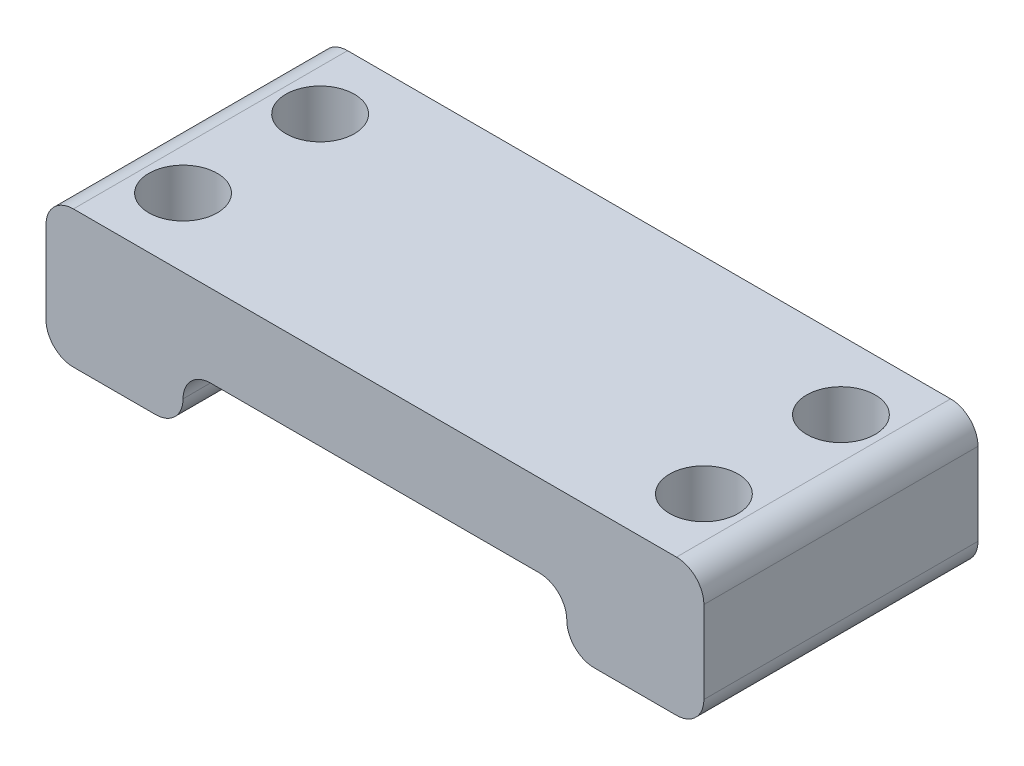
ISO-10303-21;
HEADER;
FILE_DESCRIPTION(('STEP AP214'),'2;1');
FILE_NAME('part.step','',(''),(''),'','','');
FILE_SCHEMA(('AUTOMOTIVE_DESIGN { 1 0 10303 214 1 1 1 1 }'));
ENDSEC;
DATA;
#1=APPLICATION_CONTEXT('core data for automotive mechanical design processes');
#2=APPLICATION_PROTOCOL_DEFINITION('international standard','automotive_design',2000,#1);
#3=PRODUCT_CONTEXT('',#1,'mechanical');
#4=PRODUCT('Part','Part','',(#3));
#5=PRODUCT_RELATED_PRODUCT_CATEGORY('part','',(#4));
#6=PRODUCT_DEFINITION_FORMATION('','',#4);
#7=PRODUCT_DEFINITION_CONTEXT('part definition',#1,'design');
#8=PRODUCT_DEFINITION('design','',#6,#7);
#9=PRODUCT_DEFINITION_SHAPE('','',#8);
#10=(LENGTH_UNIT() NAMED_UNIT(*) SI_UNIT(.MILLI.,.METRE.));
#11=(NAMED_UNIT(*) PLANE_ANGLE_UNIT() SI_UNIT($,.RADIAN.));
#12=(NAMED_UNIT(*) SI_UNIT($,.STERADIAN.) SOLID_ANGLE_UNIT());
#13=UNCERTAINTY_MEASURE_WITH_UNIT(LENGTH_MEASURE(1.E-05),#10,'distance_accuracy_value','');
#14=(GEOMETRIC_REPRESENTATION_CONTEXT(3) GLOBAL_UNCERTAINTY_ASSIGNED_CONTEXT((#13)) GLOBAL_UNIT_ASSIGNED_CONTEXT((#10,
#11,#12)) REPRESENTATION_CONTEXT('',''));
#15=CARTESIAN_POINT('',(0.,0.,0.));
#16=DIRECTION('',(0.,0.,1.));
#17=DIRECTION('',(1.,0.,0.));
#18=AXIS2_PLACEMENT_3D('',#15,#16,#17);
#19=CARTESIAN_POINT('',(0.,0.,0.));
#20=DIRECTION('',(0.,1.,0.));
#21=DIRECTION('',(0.,0.,1.));
#22=AXIS2_PLACEMENT_3D('',#19,#20,#21);
#23=PLANE('',#22);
#24=CARTESIAN_POINT('',(9.5,0.,-2.5));
#25=DIRECTION('',(0.,1.,0.));
#26=DIRECTION('',(0.,0.,1.));
#27=AXIS2_PLACEMENT_3D('',#24,#25,#26);
#28=CIRCLE('',#27,1.25);
#29=CARTESIAN_POINT('',(9.5,0.,-1.25));
#30=VERTEX_POINT('',#29);
#31=EDGE_CURVE('E275',#30,#30,#28,.T.);
#32=ORIENTED_EDGE('',*,*,#31,.T.);
#33=EDGE_LOOP('',(#32));
#34=FACE_BOUND('',#33,.T.);
#35=CARTESIAN_POINT('',(9.5,0.,2.5));
#36=DIRECTION('',(0.,1.,0.));
#37=DIRECTION('',(0.,0.,1.));
#38=AXIS2_PLACEMENT_3D('',#35,#36,#37);
#39=CIRCLE('',#38,1.25);
#40=CARTESIAN_POINT('',(9.5,0.,3.75));
#41=VERTEX_POINT('',#40);
#42=EDGE_CURVE('E488',#41,#41,#39,.T.);
#43=ORIENTED_EDGE('',*,*,#42,.T.);
#44=EDGE_LOOP('',(#43));
#45=FACE_BOUND('',#44,.T.);
#46=DIRECTION('',(-1.,0.,0.));
#47=VECTOR('',#46,1.);
#48=CARTESIAN_POINT('',(-12.,0.,-5.));
#49=LINE('',#48,#47);
#50=CARTESIAN_POINT('',(11.,0.,-5.));
#51=VERTEX_POINT('',#50);
#52=CARTESIAN_POINT('',(8.,0.,-5.));
#53=VERTEX_POINT('',#52);
#54=EDGE_CURVE('E292',#51,#53,#49,.T.);
#55=ORIENTED_EDGE('',*,*,#54,.F.);
#56=DIRECTION('',(0.,0.,-1.));
#57=VECTOR('',#56,1.);
#58=CARTESIAN_POINT('',(11.,0.,0.));
#59=LINE('',#58,#57);
#60=CARTESIAN_POINT('',(11.,0.,5.));
#61=VERTEX_POINT('',#60);
#62=EDGE_CURVE('E233',#51,#61,#59,.F.);
#63=ORIENTED_EDGE('',*,*,#62,.T.);
#64=DIRECTION('',(1.,0.,0.));
#65=VECTOR('',#64,1.);
#66=CARTESIAN_POINT('',(-12.,0.,5.));
#67=LINE('',#66,#65);
#68=CARTESIAN_POINT('',(8.,0.,5.));
#69=VERTEX_POINT('',#68);
#70=EDGE_CURVE('E296',#69,#61,#67,.T.);
#71=ORIENTED_EDGE('',*,*,#70,.F.);
#72=DIRECTION('',(0.,0.,1.));
#73=VECTOR('',#72,1.);
#74=CARTESIAN_POINT('',(8.,0.,0.));
#75=LINE('',#74,#73);
#76=EDGE_CURVE('E229',#69,#53,#75,.F.);
#77=ORIENTED_EDGE('',*,*,#76,.T.);
#78=EDGE_LOOP('',(#55,#63,#71,#77));
#79=FACE_BOUND('',#78,.T.);
#80=ADVANCED_FACE('F39',(#34,#45,#79),#23,.F.);
#81=CARTESIAN_POINT('',(12.,5.,-5.));
#82=DIRECTION('',(-1.,0.,0.));
#83=DIRECTION('',(0.,0.,1.));
#84=AXIS2_PLACEMENT_3D('',#81,#82,#83);
#85=PLANE('',#84);
#86=DIRECTION('',(0.,-1.,0.));
#87=VECTOR('',#86,1.);
#88=CARTESIAN_POINT('',(12.,5.,-5.));
#89=LINE('',#88,#87);
#90=CARTESIAN_POINT('',(12.,4.,-5.));
#91=VERTEX_POINT('',#90);
#92=CARTESIAN_POINT('',(12.,1.,-5.));
#93=VERTEX_POINT('',#92);
#94=EDGE_CURVE('E174',#91,#93,#89,.T.);
#95=ORIENTED_EDGE('',*,*,#94,.F.);
#96=DIRECTION('',(0.,0.,-1.));
#97=VECTOR('',#96,1.);
#98=CARTESIAN_POINT('',(12.,4.,5.));
#99=LINE('',#98,#97);
#100=CARTESIAN_POINT('',(12.,4.,5.));
#101=VERTEX_POINT('',#100);
#102=EDGE_CURVE('E226',#91,#101,#99,.F.);
#103=ORIENTED_EDGE('',*,*,#102,.T.);
#104=DIRECTION('',(0.,-1.,0.));
#105=VECTOR('',#104,1.);
#106=CARTESIAN_POINT('',(12.,5.,5.));
#107=LINE('',#106,#105);
#108=CARTESIAN_POINT('',(12.,1.,5.));
#109=VERTEX_POINT('',#108);
#110=EDGE_CURVE('E168',#101,#109,#107,.T.);
#111=ORIENTED_EDGE('',*,*,#110,.T.);
#112=DIRECTION('',(0.,0.,-1.));
#113=VECTOR('',#112,1.);
#114=CARTESIAN_POINT('',(12.,1.,-5.));
#115=LINE('',#114,#113);
#116=EDGE_CURVE('E223',#109,#93,#115,.T.);
#117=ORIENTED_EDGE('',*,*,#116,.T.);
#118=EDGE_LOOP('',(#95,#103,#111,#117));
#119=FACE_BOUND('',#118,.T.);
#120=ADVANCED_FACE('F340',(#119),#85,.F.);
#121=CARTESIAN_POINT('',(-12.,5.,-5.));
#122=DIRECTION('',(0.,0.,1.));
#123=DIRECTION('',(1.,0.,0.));
#124=AXIS2_PLACEMENT_3D('',#121,#122,#123);
#125=PLANE('',#124);
#126=CARTESIAN_POINT('',(-8.,0.,-5.));
#127=VERTEX_POINT('',#126);
#128=CARTESIAN_POINT('',(-11.,0.,-5.));
#129=VERTEX_POINT('',#128);
#130=EDGE_CURVE('E283',#127,#129,#49,.T.);
#131=ORIENTED_EDGE('',*,*,#130,.T.);
#132=CARTESIAN_POINT('',(-11.,1.,-5.));
#133=DIRECTION('',(0.,0.,1.));
#134=DIRECTION('',(1.,0.,0.));
#135=AXIS2_PLACEMENT_3D('',#132,#133,#134);
#136=CIRCLE('',#135,1.);
#137=CARTESIAN_POINT('',(-12.,1.,-5.));
#138=VERTEX_POINT('',#137);
#139=EDGE_CURVE('E213',#129,#138,#136,.F.);
#140=ORIENTED_EDGE('',*,*,#139,.T.);
#141=DIRECTION('',(0.,-1.,0.));
#142=VECTOR('',#141,1.);
#143=CARTESIAN_POINT('',(-12.,5.,-5.));
#144=LINE('',#143,#142);
#145=CARTESIAN_POINT('',(-12.,4.,-5.));
#146=VERTEX_POINT('',#145);
#147=EDGE_CURVE('E167',#146,#138,#144,.T.);
#148=ORIENTED_EDGE('',*,*,#147,.F.);
#149=CARTESIAN_POINT('',(-11.,4.,-5.));
#150=DIRECTION('',(0.,0.,1.));
#151=DIRECTION('',(1.,0.,0.));
#152=AXIS2_PLACEMENT_3D('',#149,#150,#151);
#153=CIRCLE('',#152,1.);
#154=CARTESIAN_POINT('',(-11.,5.,-5.));
#155=VERTEX_POINT('',#154);
#156=EDGE_CURVE('E172',#146,#155,#153,.F.);
#157=ORIENTED_EDGE('',*,*,#156,.T.);
#158=DIRECTION('',(-1.,0.,0.));
#159=VECTOR('',#158,1.);
#160=CARTESIAN_POINT('',(-12.,5.,-5.));
#161=LINE('',#160,#159);
#162=CARTESIAN_POINT('',(11.,5.,-5.));
#163=VERTEX_POINT('',#162);
#164=EDGE_CURVE('E285',#163,#155,#161,.T.);
#165=ORIENTED_EDGE('',*,*,#164,.F.);
#166=CARTESIAN_POINT('',(11.,4.,-5.));
#167=DIRECTION('',(0.,0.,1.));
#168=DIRECTION('',(1.,0.,0.));
#169=AXIS2_PLACEMENT_3D('',#166,#167,#168);
#170=CIRCLE('',#169,1.);
#171=EDGE_CURVE('E65',#163,#91,#170,.F.);
#172=ORIENTED_EDGE('',*,*,#171,.T.);
#173=ORIENTED_EDGE('',*,*,#94,.T.);
#174=CARTESIAN_POINT('',(11.,1.,-5.));
#175=DIRECTION('',(0.,0.,1.));
#176=DIRECTION('',(1.,0.,0.));
#177=AXIS2_PLACEMENT_3D('',#174,#175,#176);
#178=CIRCLE('',#177,1.);
#179=EDGE_CURVE('E57',#93,#51,#178,.F.);
#180=ORIENTED_EDGE('',*,*,#179,.T.);
#181=ORIENTED_EDGE('',*,*,#54,.T.);
#182=CARTESIAN_POINT('',(8.,1.,-5.));
#183=DIRECTION('',(0.,0.,1.));
#184=DIRECTION('',(1.,0.,0.));
#185=AXIS2_PLACEMENT_3D('',#182,#183,#184);
#186=CIRCLE('',#185,1.);
#187=CARTESIAN_POINT('',(7.,1.,-5.));
#188=VERTEX_POINT('',#187);
#189=EDGE_CURVE('E204',#53,#188,#186,.F.);
#190=ORIENTED_EDGE('',*,*,#189,.T.);
#191=CARTESIAN_POINT('',(6.,1.,-5.));
#192=DIRECTION('',(0.,0.,1.));
#193=DIRECTION('',(1.,0.,0.));
#194=AXIS2_PLACEMENT_3D('',#191,#192,#193);
#195=CIRCLE('',#194,1.);
#196=CARTESIAN_POINT('',(6.,2.,-5.));
#197=VERTEX_POINT('',#196);
#198=EDGE_CURVE('E246',#188,#197,#195,.T.);
#199=ORIENTED_EDGE('',*,*,#198,.T.);
#200=DIRECTION('',(-1.,0.,0.));
#201=VECTOR('',#200,1.);
#202=CARTESIAN_POINT('',(-7.,2.,-5.));
#203=LINE('',#202,#201);
#204=CARTESIAN_POINT('',(-6.,2.,-5.));
#205=VERTEX_POINT('',#204);
#206=EDGE_CURVE('E260',#197,#205,#203,.T.);
#207=ORIENTED_EDGE('',*,*,#206,.T.);
#208=CARTESIAN_POINT('',(-6.,1.,-5.));
#209=DIRECTION('',(0.,0.,1.));
#210=DIRECTION('',(1.,0.,0.));
#211=AXIS2_PLACEMENT_3D('',#208,#209,#210);
#212=CIRCLE('',#211,1.);
#213=CARTESIAN_POINT('',(-7.,1.,-5.));
#214=VERTEX_POINT('',#213);
#215=EDGE_CURVE('E11',#205,#214,#212,.T.);
#216=ORIENTED_EDGE('',*,*,#215,.T.);
#217=CARTESIAN_POINT('',(-8.,1.,-5.));
#218=DIRECTION('',(0.,0.,1.));
#219=DIRECTION('',(1.,0.,0.));
#220=AXIS2_PLACEMENT_3D('',#217,#218,#219);
#221=CIRCLE('',#220,1.);
#222=EDGE_CURVE('E201',#214,#127,#221,.F.);
#223=ORIENTED_EDGE('',*,*,#222,.T.);
#224=EDGE_LOOP('',(#131,#140,#148,#157,#165,#172,#173,#180,#181,#190,#199,#207,#216,#223));
#225=FACE_BOUND('',#224,.T.);
#226=ADVANCED_FACE('F324',(#225),#125,.F.);
#227=CARTESIAN_POINT('',(-12.,5.,-5.));
#228=DIRECTION('',(1.,0.,0.));
#229=DIRECTION('',(0.,0.,-1.));
#230=AXIS2_PLACEMENT_3D('',#227,#228,#229);
#231=PLANE('',#230);
#232=ORIENTED_EDGE('',*,*,#147,.T.);
#233=DIRECTION('',(0.,0.,1.));
#234=VECTOR('',#233,1.);
#235=CARTESIAN_POINT('',(-12.,1.,-5.));
#236=LINE('',#235,#234);
#237=CARTESIAN_POINT('',(-12.,1.,5.));
#238=VERTEX_POINT('',#237);
#239=EDGE_CURVE('E165',#138,#238,#236,.T.);
#240=ORIENTED_EDGE('',*,*,#239,.T.);
#241=DIRECTION('',(0.,-1.,0.));
#242=VECTOR('',#241,1.);
#243=CARTESIAN_POINT('',(-12.,5.,5.));
#244=LINE('',#243,#242);
#245=CARTESIAN_POINT('',(-12.,4.,5.));
#246=VERTEX_POINT('',#245);
#247=EDGE_CURVE('E147',#246,#238,#244,.T.);
#248=ORIENTED_EDGE('',*,*,#247,.F.);
#249=DIRECTION('',(0.,0.,1.));
#250=VECTOR('',#249,1.);
#251=CARTESIAN_POINT('',(-12.,4.,-5.));
#252=LINE('',#251,#250);
#253=EDGE_CURVE('E162',#246,#146,#252,.F.);
#254=ORIENTED_EDGE('',*,*,#253,.T.);
#255=EDGE_LOOP('',(#232,#240,#248,#254));
#256=FACE_BOUND('',#255,.T.);
#257=ADVANCED_FACE('F161',(#256),#231,.F.);
#258=CARTESIAN_POINT('',(-12.,5.,5.));
#259=DIRECTION('',(0.,0.,-1.));
#260=DIRECTION('',(-1.,0.,0.));
#261=AXIS2_PLACEMENT_3D('',#258,#259,#260);
#262=PLANE('',#261);
#263=ORIENTED_EDGE('',*,*,#247,.T.);
#264=CARTESIAN_POINT('',(-11.,1.,5.));
#265=DIRECTION('',(0.,0.,-1.));
#266=DIRECTION('',(-1.,0.,0.));
#267=AXIS2_PLACEMENT_3D('',#264,#265,#266);
#268=CIRCLE('',#267,1.);
#269=CARTESIAN_POINT('',(-11.,0.,5.));
#270=VERTEX_POINT('',#269);
#271=EDGE_CURVE('E155',#238,#270,#268,.F.);
#272=ORIENTED_EDGE('',*,*,#271,.T.);
#273=CARTESIAN_POINT('',(-8.,0.,5.));
#274=VERTEX_POINT('',#273);
#275=EDGE_CURVE('E289',#270,#274,#67,.T.);
#276=ORIENTED_EDGE('',*,*,#275,.T.);
#277=CARTESIAN_POINT('',(-8.,1.,5.));
#278=DIRECTION('',(0.,0.,-1.));
#279=DIRECTION('',(-1.,0.,0.));
#280=AXIS2_PLACEMENT_3D('',#277,#278,#279);
#281=CIRCLE('',#280,1.);
#282=CARTESIAN_POINT('',(-7.,1.,5.));
#283=VERTEX_POINT('',#282);
#284=EDGE_CURVE('E178',#274,#283,#281,.F.);
#285=ORIENTED_EDGE('',*,*,#284,.T.);
#286=CARTESIAN_POINT('',(-6.,1.,5.));
#287=DIRECTION('',(0.,0.,-1.));
#288=DIRECTION('',(-1.,0.,0.));
#289=AXIS2_PLACEMENT_3D('',#286,#287,#288);
#290=CIRCLE('',#289,1.);
#291=CARTESIAN_POINT('',(-6.,2.,5.));
#292=VERTEX_POINT('',#291);
#293=EDGE_CURVE('E49',#283,#292,#290,.T.);
#294=ORIENTED_EDGE('',*,*,#293,.T.);
#295=DIRECTION('',(-1.,0.,0.));
#296=VECTOR('',#295,1.);
#297=CARTESIAN_POINT('',(-7.,2.,5.));
#298=LINE('',#297,#296);
#299=CARTESIAN_POINT('',(6.,2.,5.));
#300=VERTEX_POINT('',#299);
#301=EDGE_CURVE('E253',#300,#292,#298,.T.);
#302=ORIENTED_EDGE('',*,*,#301,.F.);
#303=CARTESIAN_POINT('',(6.,1.,5.));
#304=DIRECTION('',(0.,0.,-1.));
#305=DIRECTION('',(-1.,0.,0.));
#306=AXIS2_PLACEMENT_3D('',#303,#304,#305);
#307=CIRCLE('',#306,1.);
#308=CARTESIAN_POINT('',(7.,1.,5.));
#309=VERTEX_POINT('',#308);
#310=EDGE_CURVE('E243',#300,#309,#307,.T.);
#311=ORIENTED_EDGE('',*,*,#310,.T.);
#312=CARTESIAN_POINT('',(8.,1.,5.));
#313=DIRECTION('',(0.,0.,-1.));
#314=DIRECTION('',(-1.,0.,0.));
#315=AXIS2_PLACEMENT_3D('',#312,#313,#314);
#316=CIRCLE('',#315,1.);
#317=EDGE_CURVE('E185',#309,#69,#316,.F.);
#318=ORIENTED_EDGE('',*,*,#317,.T.);
#319=ORIENTED_EDGE('',*,*,#70,.T.);
#320=CARTESIAN_POINT('',(11.,1.,5.));
#321=DIRECTION('',(0.,0.,-1.));
#322=DIRECTION('',(-1.,0.,0.));
#323=AXIS2_PLACEMENT_3D('',#320,#321,#322);
#324=CIRCLE('',#323,1.);
#325=EDGE_CURVE('E188',#61,#109,#324,.F.);
#326=ORIENTED_EDGE('',*,*,#325,.T.);
#327=ORIENTED_EDGE('',*,*,#110,.F.);
#328=CARTESIAN_POINT('',(11.,4.,5.));
#329=DIRECTION('',(0.,0.,-1.));
#330=DIRECTION('',(-1.,0.,0.));
#331=AXIS2_PLACEMENT_3D('',#328,#329,#330);
#332=CIRCLE('',#331,1.);
#333=CARTESIAN_POINT('',(11.,5.,5.));
#334=VERTEX_POINT('',#333);
#335=EDGE_CURVE('E156',#101,#334,#332,.F.);
#336=ORIENTED_EDGE('',*,*,#335,.T.);
#337=DIRECTION('',(1.,0.,0.));
#338=VECTOR('',#337,1.);
#339=CARTESIAN_POINT('',(-12.,5.,5.));
#340=LINE('',#339,#338);
#341=CARTESIAN_POINT('',(-11.,5.,5.));
#342=VERTEX_POINT('',#341);
#343=EDGE_CURVE('E149',#342,#334,#340,.T.);
#344=ORIENTED_EDGE('',*,*,#343,.F.);
#345=CARTESIAN_POINT('',(-11.,4.,5.));
#346=DIRECTION('',(0.,0.,-1.));
#347=DIRECTION('',(-1.,0.,0.));
#348=AXIS2_PLACEMENT_3D('',#345,#346,#347);
#349=CIRCLE('',#348,1.);
#350=EDGE_CURVE('E144',#342,#246,#349,.F.);
#351=ORIENTED_EDGE('',*,*,#350,.T.);
#352=EDGE_LOOP('',(#263,#272,#276,#285,#294,#302,#311,#318,#319,#326,#327,#336,#344,#351));
#353=FACE_BOUND('',#352,.T.);
#354=ADVANCED_FACE('F146',(#353),#262,.F.);
#355=CARTESIAN_POINT('',(0.,5.,0.));
#356=DIRECTION('',(0.,1.,0.));
#357=DIRECTION('',(0.,0.,1.));
#358=AXIS2_PLACEMENT_3D('',#355,#356,#357);
#359=PLANE('',#358);
#360=CARTESIAN_POINT('',(9.5,5.,-2.5));
#361=DIRECTION('',(0.,1.,0.));
#362=DIRECTION('',(0.,0.,1.));
#363=AXIS2_PLACEMENT_3D('',#360,#361,#362);
#364=CIRCLE('',#363,1.25);
#365=CARTESIAN_POINT('',(9.5,5.,-1.25));
#366=VERTEX_POINT('',#365);
#367=EDGE_CURVE('E475',#366,#366,#364,.T.);
#368=ORIENTED_EDGE('',*,*,#367,.F.);
#369=EDGE_LOOP('',(#368));
#370=FACE_BOUND('',#369,.T.);
#371=CARTESIAN_POINT('',(-9.5,5.,2.5));
#372=DIRECTION('',(0.,1.,0.));
#373=DIRECTION('',(0.,0.,1.));
#374=AXIS2_PLACEMENT_3D('',#371,#372,#373);
#375=CIRCLE('',#374,1.25);
#376=CARTESIAN_POINT('',(-9.5,5.,3.75));
#377=VERTEX_POINT('',#376);
#378=EDGE_CURVE('E278',#377,#377,#375,.T.);
#379=ORIENTED_EDGE('',*,*,#378,.F.);
#380=EDGE_LOOP('',(#379));
#381=FACE_BOUND('',#380,.T.);
#382=CARTESIAN_POINT('',(9.5,5.,2.5));
#383=DIRECTION('',(0.,1.,0.));
#384=DIRECTION('',(0.,0.,1.));
#385=AXIS2_PLACEMENT_3D('',#382,#383,#384);
#386=CIRCLE('',#385,1.25);
#387=CARTESIAN_POINT('',(9.5,5.,3.75));
#388=VERTEX_POINT('',#387);
#389=EDGE_CURVE('E484',#388,#388,#386,.T.);
#390=ORIENTED_EDGE('',*,*,#389,.F.);
#391=EDGE_LOOP('',(#390));
#392=FACE_BOUND('',#391,.T.);
#393=CARTESIAN_POINT('',(-9.5,5.,-2.5));
#394=DIRECTION('',(0.,1.,0.));
#395=DIRECTION('',(0.,0.,1.));
#396=AXIS2_PLACEMENT_3D('',#393,#394,#395);
#397=CIRCLE('',#396,1.25);
#398=CARTESIAN_POINT('',(-9.5,5.,-1.25));
#399=VERTEX_POINT('',#398);
#400=EDGE_CURVE('E269',#399,#399,#397,.T.);
#401=ORIENTED_EDGE('',*,*,#400,.F.);
#402=EDGE_LOOP('',(#401));
#403=FACE_BOUND('',#402,.T.);
#404=ORIENTED_EDGE('',*,*,#164,.T.);
#405=DIRECTION('',(0.,0.,1.));
#406=VECTOR('',#405,1.);
#407=CARTESIAN_POINT('',(-11.,5.,5.));
#408=LINE('',#407,#406);
#409=EDGE_CURVE('E220',#155,#342,#408,.T.);
#410=ORIENTED_EDGE('',*,*,#409,.T.);
#411=ORIENTED_EDGE('',*,*,#343,.T.);
#412=DIRECTION('',(0.,0.,-1.));
#413=VECTOR('',#412,1.);
#414=CARTESIAN_POINT('',(11.,5.,-5.));
#415=LINE('',#414,#413);
#416=EDGE_CURVE('E216',#334,#163,#415,.T.);
#417=ORIENTED_EDGE('',*,*,#416,.T.);
#418=EDGE_LOOP('',(#404,#410,#411,#417));
#419=FACE_BOUND('',#418,.T.);
#420=ADVANCED_FACE('F346',(#370,#381,#392,#403,#419),#359,.T.);
#421=CARTESIAN_POINT('',(-9.5,0.,2.5));
#422=DIRECTION('',(0.,1.,0.));
#423=DIRECTION('',(0.,0.,1.));
#424=AXIS2_PLACEMENT_3D('',#421,#422,#423);
#425=CIRCLE('',#424,1.25);
#426=CARTESIAN_POINT('',(-9.5,0.,3.75));
#427=VERTEX_POINT('',#426);
#428=EDGE_CURVE('E477',#427,#427,#425,.T.);
#429=ORIENTED_EDGE('',*,*,#428,.T.);
#430=EDGE_LOOP('',(#429));
#431=FACE_BOUND('',#430,.T.);
#432=CARTESIAN_POINT('',(-9.5,0.,-2.5));
#433=DIRECTION('',(0.,1.,0.));
#434=DIRECTION('',(0.,0.,1.));
#435=AXIS2_PLACEMENT_3D('',#432,#433,#434);
#436=CIRCLE('',#435,1.25);
#437=CARTESIAN_POINT('',(-9.5,0.,-1.25));
#438=VERTEX_POINT('',#437);
#439=EDGE_CURVE('E263',#438,#438,#436,.T.);
#440=ORIENTED_EDGE('',*,*,#439,.T.);
#441=EDGE_LOOP('',(#440));
#442=FACE_BOUND('',#441,.T.);
#443=ORIENTED_EDGE('',*,*,#275,.F.);
#444=DIRECTION('',(0.,0.,1.));
#445=VECTOR('',#444,1.);
#446=CARTESIAN_POINT('',(-11.,0.,0.));
#447=LINE('',#446,#445);
#448=EDGE_CURVE('E198',#270,#129,#447,.F.);
#449=ORIENTED_EDGE('',*,*,#448,.T.);
#450=ORIENTED_EDGE('',*,*,#130,.F.);
#451=DIRECTION('',(0.,0.,1.));
#452=VECTOR('',#451,1.);
#453=CARTESIAN_POINT('',(-8.,0.,0.));
#454=LINE('',#453,#452);
#455=EDGE_CURVE('E195',#127,#274,#454,.T.);
#456=ORIENTED_EDGE('',*,*,#455,.T.);
#457=EDGE_LOOP('',(#443,#449,#450,#456));
#458=FACE_BOUND('',#457,.T.);
#459=ADVANCED_FACE('F310',(#431,#442,#458),#23,.F.);
#460=CARTESIAN_POINT('',(-7.,2.,-5.));
#461=DIRECTION('',(0.,1.,0.));
#462=DIRECTION('',(0.,0.,1.));
#463=AXIS2_PLACEMENT_3D('',#460,#461,#462);
#464=PLANE('',#463);
#465=ORIENTED_EDGE('',*,*,#206,.F.);
#466=DIRECTION('',(0.,0.,1.));
#467=VECTOR('',#466,1.);
#468=CARTESIAN_POINT('',(6.,2.,5.));
#469=LINE('',#468,#467);
#470=EDGE_CURVE('E240',#197,#300,#469,.T.);
#471=ORIENTED_EDGE('',*,*,#470,.T.);
#472=ORIENTED_EDGE('',*,*,#301,.T.);
#473=DIRECTION('',(0.,0.,1.));
#474=VECTOR('',#473,1.);
#475=CARTESIAN_POINT('',(-6.,2.,-5.));
#476=LINE('',#475,#474);
#477=EDGE_CURVE('E236',#292,#205,#476,.F.);
#478=ORIENTED_EDGE('',*,*,#477,.T.);
#479=EDGE_LOOP('',(#465,#471,#472,#478));
#480=FACE_BOUND('',#479,.T.);
#481=ADVANCED_FACE('F321',(#480),#464,.F.);
#482=CARTESIAN_POINT('',(-11.,1.,-5.));
#483=DIRECTION('',(0.,0.,1.));
#484=DIRECTION('',(1.,0.,0.));
#485=AXIS2_PLACEMENT_3D('',#482,#483,#484);
#486=CYLINDRICAL_SURFACE('',#485,1.);
#487=ORIENTED_EDGE('',*,*,#139,.F.);
#488=ORIENTED_EDGE('',*,*,#448,.F.);
#489=ORIENTED_EDGE('',*,*,#271,.F.);
#490=ORIENTED_EDGE('',*,*,#239,.F.);
#491=EDGE_LOOP('',(#487,#488,#489,#490));
#492=FACE_BOUND('',#491,.T.);
#493=ADVANCED_FACE('F305',(#492),#486,.T.);
#494=CARTESIAN_POINT('',(-11.,4.,0.));
#495=DIRECTION('',(0.,0.,-1.));
#496=DIRECTION('',(-1.,0.,0.));
#497=AXIS2_PLACEMENT_3D('',#494,#495,#496);
#498=CYLINDRICAL_SURFACE('',#497,1.);
#499=ORIENTED_EDGE('',*,*,#156,.F.);
#500=ORIENTED_EDGE('',*,*,#253,.F.);
#501=ORIENTED_EDGE('',*,*,#350,.F.);
#502=ORIENTED_EDGE('',*,*,#409,.F.);
#503=EDGE_LOOP('',(#499,#500,#501,#502));
#504=FACE_BOUND('',#503,.T.);
#505=ADVANCED_FACE('F171',(#504),#498,.T.);
#506=CARTESIAN_POINT('',(11.,4.,0.));
#507=DIRECTION('',(0.,0.,1.));
#508=DIRECTION('',(1.,0.,0.));
#509=AXIS2_PLACEMENT_3D('',#506,#507,#508);
#510=CYLINDRICAL_SURFACE('',#509,1.);
#511=ORIENTED_EDGE('',*,*,#335,.F.);
#512=ORIENTED_EDGE('',*,*,#102,.F.);
#513=ORIENTED_EDGE('',*,*,#171,.F.);
#514=ORIENTED_EDGE('',*,*,#416,.F.);
#515=EDGE_LOOP('',(#511,#512,#513,#514));
#516=FACE_BOUND('',#515,.T.);
#517=ADVANCED_FACE('F343',(#516),#510,.T.);
#518=CARTESIAN_POINT('',(11.,1.,-5.));
#519=DIRECTION('',(0.,0.,-1.));
#520=DIRECTION('',(-1.,0.,0.));
#521=AXIS2_PLACEMENT_3D('',#518,#519,#520);
#522=CYLINDRICAL_SURFACE('',#521,1.);
#523=ORIENTED_EDGE('',*,*,#325,.F.);
#524=ORIENTED_EDGE('',*,*,#62,.F.);
#525=ORIENTED_EDGE('',*,*,#179,.F.);
#526=ORIENTED_EDGE('',*,*,#116,.F.);
#527=EDGE_LOOP('',(#523,#524,#525,#526));
#528=FACE_BOUND('',#527,.T.);
#529=ADVANCED_FACE('F336',(#528),#522,.T.);
#530=CARTESIAN_POINT('',(6.,1.,-5.));
#531=DIRECTION('',(0.,0.,-1.));
#532=DIRECTION('',(-1.,0.,0.));
#533=AXIS2_PLACEMENT_3D('',#530,#531,#532);
#534=CYLINDRICAL_SURFACE('',#533,1.);
#535=ORIENTED_EDGE('',*,*,#470,.F.);
#536=ORIENTED_EDGE('',*,*,#198,.F.);
#537=DIRECTION('',(0.,0.,1.));
#538=VECTOR('',#537,1.);
#539=CARTESIAN_POINT('',(7.,1.,-5.));
#540=LINE('',#539,#538);
#541=EDGE_CURVE('E250',#309,#188,#540,.F.);
#542=ORIENTED_EDGE('',*,*,#541,.F.);
#543=ORIENTED_EDGE('',*,*,#310,.F.);
#544=EDGE_LOOP('',(#535,#536,#542,#543));
#545=FACE_BOUND('',#544,.T.);
#546=ADVANCED_FACE('F327',(#545),#534,.F.);
#547=CARTESIAN_POINT('',(8.,1.,-5.));
#548=DIRECTION('',(0.,0.,1.));
#549=DIRECTION('',(1.,0.,0.));
#550=AXIS2_PLACEMENT_3D('',#547,#548,#549);
#551=CYLINDRICAL_SURFACE('',#550,1.);
#552=ORIENTED_EDGE('',*,*,#189,.F.);
#553=ORIENTED_EDGE('',*,*,#76,.F.);
#554=ORIENTED_EDGE('',*,*,#317,.F.);
#555=ORIENTED_EDGE('',*,*,#541,.T.);
#556=EDGE_LOOP('',(#552,#553,#554,#555));
#557=FACE_BOUND('',#556,.T.);
#558=ADVANCED_FACE('F335',(#557),#551,.T.);
#559=CARTESIAN_POINT('',(-8.,1.,0.));
#560=DIRECTION('',(0.,0.,1.));
#561=DIRECTION('',(1.,0.,0.));
#562=AXIS2_PLACEMENT_3D('',#559,#560,#561);
#563=CYLINDRICAL_SURFACE('',#562,1.);
#564=ORIENTED_EDGE('',*,*,#455,.F.);
#565=ORIENTED_EDGE('',*,*,#222,.F.);
#566=DIRECTION('',(0.,0.,1.));
#567=VECTOR('',#566,1.);
#568=CARTESIAN_POINT('',(-7.,1.,-5.));
#569=LINE('',#568,#567);
#570=EDGE_CURVE('E43',#283,#214,#569,.F.);
#571=ORIENTED_EDGE('',*,*,#570,.F.);
#572=ORIENTED_EDGE('',*,*,#284,.F.);
#573=EDGE_LOOP('',(#564,#565,#571,#572));
#574=FACE_BOUND('',#573,.T.);
#575=ADVANCED_FACE('F41',(#574),#563,.T.);
#576=CARTESIAN_POINT('',(-6.,1.,-5.));
#577=DIRECTION('',(0.,0.,-1.));
#578=DIRECTION('',(-1.,0.,0.));
#579=AXIS2_PLACEMENT_3D('',#576,#577,#578);
#580=CYLINDRICAL_SURFACE('',#579,1.);
#581=ORIENTED_EDGE('',*,*,#215,.F.);
#582=ORIENTED_EDGE('',*,*,#477,.F.);
#583=ORIENTED_EDGE('',*,*,#293,.F.);
#584=ORIENTED_EDGE('',*,*,#570,.T.);
#585=EDGE_LOOP('',(#581,#582,#583,#584));
#586=FACE_BOUND('',#585,.T.);
#587=ADVANCED_FACE('F323',(#586),#580,.F.);
#588=CARTESIAN_POINT('',(-9.5,0.,-2.5));
#589=DIRECTION('',(0.,1.,0.));
#590=DIRECTION('',(0.,0.,1.));
#591=AXIS2_PLACEMENT_3D('',#588,#589,#590);
#592=CYLINDRICAL_SURFACE('',#591,1.25);
#593=ORIENTED_EDGE('',*,*,#439,.F.);
#594=EDGE_LOOP('',(#593));
#595=FACE_BOUND('',#594,.T.);
#596=ORIENTED_EDGE('',*,*,#400,.T.);
#597=EDGE_LOOP('',(#596));
#598=FACE_BOUND('',#597,.T.);
#599=ADVANCED_FACE('F385',(#595,#598),#592,.F.);
#600=CARTESIAN_POINT('',(-9.5,0.,2.5));
#601=DIRECTION('',(0.,1.,0.));
#602=DIRECTION('',(0.,0.,1.));
#603=AXIS2_PLACEMENT_3D('',#600,#601,#602);
#604=CYLINDRICAL_SURFACE('',#603,1.25);
#605=ORIENTED_EDGE('',*,*,#428,.F.);
#606=EDGE_LOOP('',(#605));
#607=FACE_BOUND('',#606,.T.);
#608=ORIENTED_EDGE('',*,*,#378,.T.);
#609=EDGE_LOOP('',(#608));
#610=FACE_BOUND('',#609,.T.);
#611=ADVANCED_FACE('F390',(#607,#610),#604,.F.);
#612=CARTESIAN_POINT('',(9.5,0.,2.5));
#613=DIRECTION('',(0.,1.,0.));
#614=DIRECTION('',(0.,0.,1.));
#615=AXIS2_PLACEMENT_3D('',#612,#613,#614);
#616=CYLINDRICAL_SURFACE('',#615,1.25);
#617=ORIENTED_EDGE('',*,*,#42,.F.);
#618=EDGE_LOOP('',(#617));
#619=FACE_BOUND('',#618,.T.);
#620=ORIENTED_EDGE('',*,*,#389,.T.);
#621=EDGE_LOOP('',(#620));
#622=FACE_BOUND('',#621,.T.);
#623=ADVANCED_FACE('F448',(#619,#622),#616,.F.);
#624=CARTESIAN_POINT('',(9.5,0.,-2.5));
#625=DIRECTION('',(0.,1.,0.));
#626=DIRECTION('',(0.,0.,1.));
#627=AXIS2_PLACEMENT_3D('',#624,#625,#626);
#628=CYLINDRICAL_SURFACE('',#627,1.25);
#629=ORIENTED_EDGE('',*,*,#31,.F.);
#630=EDGE_LOOP('',(#629));
#631=FACE_BOUND('',#630,.T.);
#632=ORIENTED_EDGE('',*,*,#367,.T.);
#633=EDGE_LOOP('',(#632));
#634=FACE_BOUND('',#633,.T.);
#635=ADVANCED_FACE('F458',(#631,#634),#628,.F.);
#636=CLOSED_SHELL('',(#80,#120,#226,#257,#354,#420,#459,#481,#493,#505,#517,#529,#546,#558,#575,
#587,#599,#611,#623,#635));
#637=MANIFOLD_SOLID_BREP('B2',#636);
#638=ADVANCED_BREP_SHAPE_REPRESENTATION('',(#18,#637),#14);
#639=SHAPE_DEFINITION_REPRESENTATION(#9,#638);
ENDSEC;
END-ISO-10303-21;
